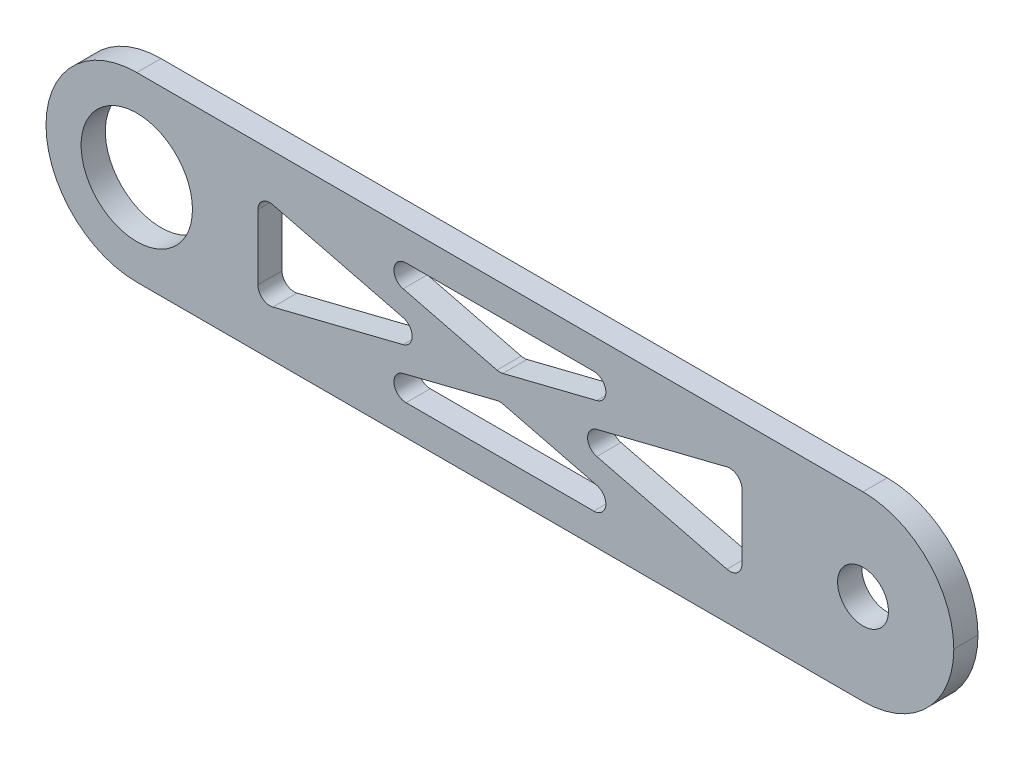
ISO-10303-21;
HEADER;
FILE_DESCRIPTION(('STEP AP214'),'2;1');
FILE_NAME('part.step','',(''),(''),'','','');
FILE_SCHEMA(('AUTOMOTIVE_DESIGN { 1 0 10303 214 1 1 1 1 }'));
ENDSEC;
DATA;
#1=APPLICATION_CONTEXT('core data for automotive mechanical design processes');
#2=APPLICATION_PROTOCOL_DEFINITION('international standard','automotive_design',2000,#1);
#3=PRODUCT_CONTEXT('',#1,'mechanical');
#4=PRODUCT('Part','Part','',(#3));
#5=PRODUCT_RELATED_PRODUCT_CATEGORY('part','',(#4));
#6=PRODUCT_DEFINITION_FORMATION('','',#4);
#7=PRODUCT_DEFINITION_CONTEXT('part definition',#1,'design');
#8=PRODUCT_DEFINITION('design','',#6,#7);
#9=PRODUCT_DEFINITION_SHAPE('','',#8);
#10=(LENGTH_UNIT() NAMED_UNIT(*) SI_UNIT(.MILLI.,.METRE.));
#11=(NAMED_UNIT(*) PLANE_ANGLE_UNIT() SI_UNIT($,.RADIAN.));
#12=(NAMED_UNIT(*) SI_UNIT($,.STERADIAN.) SOLID_ANGLE_UNIT());
#13=UNCERTAINTY_MEASURE_WITH_UNIT(LENGTH_MEASURE(1.E-05),#10,'distance_accuracy_value','');
#14=(GEOMETRIC_REPRESENTATION_CONTEXT(3) GLOBAL_UNCERTAINTY_ASSIGNED_CONTEXT((#13)) GLOBAL_UNIT_ASSIGNED_CONTEXT((#10,
#11,#12)) REPRESENTATION_CONTEXT('',''));
#15=CARTESIAN_POINT('',(0.,0.,0.));
#16=DIRECTION('',(0.,0.,1.));
#17=DIRECTION('',(1.,0.,0.));
#18=AXIS2_PLACEMENT_3D('',#15,#16,#17);
#19=CARTESIAN_POINT('',(0.,0.,-2.));
#20=DIRECTION('',(0.,0.,1.));
#21=DIRECTION('',(-1.,0.,0.));
#22=AXIS2_PLACEMENT_3D('',#19,#20,#21);
#23=PLANE('',#22);
#24=DIRECTION('',(0.970142500145332,-0.242535625036334,0.));
#25=VECTOR('',#24,1.);
#26=CARTESIAN_POINT('',(0.242535625036335,0.970142500145339,-2.));
#27=LINE('',#26,#25);
#28=CARTESIAN_POINT('',(8.00367562619901,-0.970142500145333,-2.));
#29=VERTEX_POINT('',#28);
#30=CARTESIAN_POINT('',(18.7574643749637,-3.6585896873365,-2.));
#31=VERTEX_POINT('',#30);
#32=EDGE_CURVE('E599',#29,#31,#27,.T.);
#33=ORIENTED_EDGE('',*,*,#32,.T.);
#34=CARTESIAN_POINT('',(19.,-2.68844718719117,-2.));
#35=DIRECTION('',(0.,0.,-1.));
#36=DIRECTION('',(-1.,0.,0.));
#37=AXIS2_PLACEMENT_3D('',#34,#35,#36);
#38=CIRCLE('',#37,1.);
#39=CARTESIAN_POINT('',(20.,-2.68844718719117,-2.));
#40=VERTEX_POINT('',#39);
#41=EDGE_CURVE('E391',#40,#31,#38,.T.);
#42=ORIENTED_EDGE('',*,*,#41,.F.);
#43=DIRECTION('',(0.,1.,0.));
#44=VECTOR('',#43,1.);
#45=CARTESIAN_POINT('',(20.,0.,-2.));
#46=LINE('',#45,#44);
#47=CARTESIAN_POINT('',(20.,2.68844718719117,-2.));
#48=VERTEX_POINT('',#47);
#49=EDGE_CURVE('E596',#40,#48,#46,.T.);
#50=ORIENTED_EDGE('',*,*,#49,.T.);
#51=CARTESIAN_POINT('',(19.,2.68844718719117,-2.));
#52=DIRECTION('',(0.,0.,-1.));
#53=DIRECTION('',(-1.,0.,0.));
#54=AXIS2_PLACEMENT_3D('',#51,#52,#53);
#55=CIRCLE('',#54,1.);
#56=CARTESIAN_POINT('',(18.7574643749637,3.6585896873365,-2.));
#57=VERTEX_POINT('',#56);
#58=EDGE_CURVE('E403',#57,#48,#55,.T.);
#59=ORIENTED_EDGE('',*,*,#58,.F.);
#60=DIRECTION('',(0.970142500145332,0.242535625036333,0.));
#61=VECTOR('',#60,1.);
#62=CARTESIAN_POINT('',(0.242535625036335,-0.970142500145338,-2.));
#63=LINE('',#62,#61);
#64=CARTESIAN_POINT('',(8.00367562619901,0.970142500145332,-2.));
#65=VERTEX_POINT('',#64);
#66=EDGE_CURVE('E602',#65,#57,#63,.T.);
#67=ORIENTED_EDGE('',*,*,#66,.F.);
#68=CARTESIAN_POINT('',(8.24621125123534,0.,-2.));
#69=DIRECTION('',(0.,0.,-1.));
#70=DIRECTION('',(-1.,0.,0.));
#71=AXIS2_PLACEMENT_3D('',#68,#69,#70);
#72=CIRCLE('',#71,1.);
#73=EDGE_CURVE('E397',#29,#65,#72,.T.);
#74=ORIENTED_EDGE('',*,*,#73,.F.);
#75=EDGE_LOOP('',(#33,#42,#50,#59,#67,#74));
#76=FACE_BOUND('',#75,.T.);
#77=DIRECTION('',(0.970142500145332,0.242535625036333,0.));
#78=VECTOR('',#77,1.);
#79=CARTESIAN_POINT('',(-0.242535625036333,0.970142500145334,-2.));
#80=LINE('',#79,#78);
#81=CARTESIAN_POINT('',(0.242535625036326,1.0914103126635,-2.));
#82=VERTEX_POINT('',#81);
#83=CARTESIAN_POINT('',(7.996324373801,3.02985749985467,-2.));
#84=VERTEX_POINT('',#83);
#85=EDGE_CURVE('E454',#82,#84,#80,.T.);
#86=ORIENTED_EDGE('',*,*,#85,.T.);
#87=CARTESIAN_POINT('',(7.75378874876467,4.,-2.));
#88=DIRECTION('',(0.,0.,-1.));
#89=DIRECTION('',(-1.,0.,0.));
#90=AXIS2_PLACEMENT_3D('',#87,#88,#89);
#91=CIRCLE('',#90,1.);
#92=CARTESIAN_POINT('',(7.75378874876467,5.,-2.));
#93=VERTEX_POINT('',#92);
#94=EDGE_CURVE('E427',#93,#84,#91,.T.);
#95=ORIENTED_EDGE('',*,*,#94,.F.);
#96=DIRECTION('',(1.,0.,0.));
#97=VECTOR('',#96,1.);
#98=CARTESIAN_POINT('',(0.,5.,-2.));
#99=LINE('',#98,#97);
#100=CARTESIAN_POINT('',(-7.75378874876468,5.,-2.));
#101=VERTEX_POINT('',#100);
#102=EDGE_CURVE('E449',#101,#93,#99,.T.);
#103=ORIENTED_EDGE('',*,*,#102,.F.);
#104=CARTESIAN_POINT('',(-7.75378874876468,4.,-2.));
#105=DIRECTION('',(0.,0.,-1.));
#106=DIRECTION('',(-1.,0.,0.));
#107=AXIS2_PLACEMENT_3D('',#104,#105,#106);
#108=CIRCLE('',#107,1.);
#109=CARTESIAN_POINT('',(-7.99632437380101,3.02985749985467,-2.));
#110=VERTEX_POINT('',#109);
#111=EDGE_CURVE('E421',#110,#101,#108,.T.);
#112=ORIENTED_EDGE('',*,*,#111,.F.);
#113=DIRECTION('',(0.970142500145332,-0.242535625036333,0.));
#114=VECTOR('',#113,1.);
#115=CARTESIAN_POINT('',(0.242535625036333,0.97014250014533,-2.));
#116=LINE('',#115,#114);
#117=CARTESIAN_POINT('',(-0.24253562503634,1.0914103126635,-2.));
#118=VERTEX_POINT('',#117);
#119=EDGE_CURVE('E583',#110,#118,#116,.T.);
#120=ORIENTED_EDGE('',*,*,#119,.T.);
#121=CARTESIAN_POINT('',(0.,2.06155281280883,-2.));
#122=DIRECTION('',(0.,0.,-1.));
#123=DIRECTION('',(-1.,0.,0.));
#124=AXIS2_PLACEMENT_3D('',#121,#122,#123);
#125=CIRCLE('',#124,1.);
#126=EDGE_CURVE('E432',#82,#118,#125,.T.);
#127=ORIENTED_EDGE('',*,*,#126,.F.);
#128=EDGE_LOOP('',(#86,#95,#103,#112,#120,#127));
#129=FACE_BOUND('',#128,.T.);
#130=CARTESIAN_POINT('',(-30.,0.,-2.));
#131=DIRECTION('',(0.,0.,-1.));
#132=DIRECTION('',(-1.,0.,0.));
#133=AXIS2_PLACEMENT_3D('',#130,#131,#132);
#134=CIRCLE('',#133,7.5);
#135=CARTESIAN_POINT('',(-30.,7.5,-2.));
#136=VERTEX_POINT('',#135);
#137=CARTESIAN_POINT('',(-37.5,0.,-2.));
#138=VERTEX_POINT('',#137);
#139=EDGE_CURVE('E280',#136,#138,#134,.F.);
#140=ORIENTED_EDGE('',*,*,#139,.F.);
#141=DIRECTION('',(-1.,0.,0.));
#142=VECTOR('',#141,1.);
#143=CARTESIAN_POINT('',(-37.5,7.5,-2.));
#144=LINE('',#143,#142);
#145=CARTESIAN_POINT('',(30.,7.5,-2.));
#146=VERTEX_POINT('',#145);
#147=EDGE_CURVE('E471',#146,#136,#144,.T.);
#148=ORIENTED_EDGE('',*,*,#147,.F.);
#149=CARTESIAN_POINT('',(30.,0.,-2.));
#150=DIRECTION('',(0.,0.,-1.));
#151=DIRECTION('',(-1.,0.,0.));
#152=AXIS2_PLACEMENT_3D('',#149,#150,#151);
#153=CIRCLE('',#152,7.5);
#154=CARTESIAN_POINT('',(37.5,0.,-2.));
#155=VERTEX_POINT('',#154);
#156=EDGE_CURVE('E277',#155,#146,#153,.F.);
#157=ORIENTED_EDGE('',*,*,#156,.F.);
#158=CARTESIAN_POINT('',(30.,0.,-2.));
#159=DIRECTION('',(0.,0.,-1.));
#160=DIRECTION('',(-1.,0.,0.));
#161=AXIS2_PLACEMENT_3D('',#158,#159,#160);
#162=CIRCLE('',#161,7.5);
#163=CARTESIAN_POINT('',(30.,-7.5,-2.));
#164=VERTEX_POINT('',#163);
#165=EDGE_CURVE('E243',#164,#155,#162,.F.);
#166=ORIENTED_EDGE('',*,*,#165,.F.);
#167=DIRECTION('',(1.,0.,0.));
#168=VECTOR('',#167,1.);
#169=CARTESIAN_POINT('',(-37.5,-7.5,-2.));
#170=LINE('',#169,#168);
#171=CARTESIAN_POINT('',(-30.,-7.5,-2.));
#172=VERTEX_POINT('',#171);
#173=EDGE_CURVE('E257',#172,#164,#170,.T.);
#174=ORIENTED_EDGE('',*,*,#173,.F.);
#175=CARTESIAN_POINT('',(-30.,0.,-2.));
#176=DIRECTION('',(0.,0.,-1.));
#177=DIRECTION('',(-1.,0.,0.));
#178=AXIS2_PLACEMENT_3D('',#175,#176,#177);
#179=CIRCLE('',#178,7.5);
#180=EDGE_CURVE('E283',#138,#172,#179,.F.);
#181=ORIENTED_EDGE('',*,*,#180,.F.);
#182=EDGE_LOOP('',(#140,#148,#157,#166,#174,#181));
#183=FACE_BOUND('',#182,.T.);
#184=CARTESIAN_POINT('',(30.,0.,-2.));
#185=DIRECTION('',(0.,0.,1.));
#186=DIRECTION('',(1.,0.,0.));
#187=AXIS2_PLACEMENT_3D('',#184,#185,#186);
#188=CIRCLE('',#187,2.1);
#189=CARTESIAN_POINT('',(32.1,0.,-2.));
#190=VERTEX_POINT('',#189);
#191=EDGE_CURVE('E464',#190,#190,#188,.T.);
#192=ORIENTED_EDGE('',*,*,#191,.T.);
#193=EDGE_LOOP('',(#192));
#194=FACE_BOUND('',#193,.T.);
#195=CARTESIAN_POINT('',(-30.,0.,-2.));
#196=DIRECTION('',(0.,0.,1.));
#197=DIRECTION('',(1.,0.,0.));
#198=AXIS2_PLACEMENT_3D('',#195,#196,#197);
#199=CIRCLE('',#198,4.6);
#200=CARTESIAN_POINT('',(-25.4,0.,-2.));
#201=VERTEX_POINT('',#200);
#202=EDGE_CURVE('E460',#201,#201,#199,.T.);
#203=ORIENTED_EDGE('',*,*,#202,.T.);
#204=EDGE_LOOP('',(#203));
#205=FACE_BOUND('',#204,.T.);
#206=DIRECTION('',(0.970142500145332,0.242535625036333,0.));
#207=VECTOR('',#206,1.);
#208=CARTESIAN_POINT('',(-0.242535625036334,0.970142500145334,-2.));
#209=LINE('',#208,#207);
#210=CARTESIAN_POINT('',(-18.7574643749637,-3.6585896873365,-2.));
#211=VERTEX_POINT('',#210);
#212=CARTESIAN_POINT('',(-8.003675626199,-0.970142500145333,-2.));
#213=VERTEX_POINT('',#212);
#214=EDGE_CURVE('E448',#211,#213,#209,.T.);
#215=ORIENTED_EDGE('',*,*,#214,.T.);
#216=CARTESIAN_POINT('',(-8.24621125123533,0.,-2.));
#217=DIRECTION('',(0.,0.,-1.));
#218=DIRECTION('',(-1.,0.,0.));
#219=AXIS2_PLACEMENT_3D('',#216,#217,#218);
#220=CIRCLE('',#219,1.);
#221=CARTESIAN_POINT('',(-8.003675626199,0.970142500145331,-2.));
#222=VERTEX_POINT('',#221);
#223=EDGE_CURVE('E409',#222,#213,#220,.T.);
#224=ORIENTED_EDGE('',*,*,#223,.F.);
#225=DIRECTION('',(0.970142500145332,-0.242535625036333,0.));
#226=VECTOR('',#225,1.);
#227=CARTESIAN_POINT('',(-0.242535625036334,-0.970142500145336,-2.));
#228=LINE('',#227,#226);
#229=CARTESIAN_POINT('',(-18.7574643749637,3.6585896873365,-2.));
#230=VERTEX_POINT('',#229);
#231=EDGE_CURVE('E451',#230,#222,#228,.T.);
#232=ORIENTED_EDGE('',*,*,#231,.F.);
#233=CARTESIAN_POINT('',(-19.,2.68844718719117,-2.));
#234=DIRECTION('',(0.,0.,-1.));
#235=DIRECTION('',(-1.,0.,0.));
#236=AXIS2_PLACEMENT_3D('',#233,#234,#235);
#237=CIRCLE('',#236,1.);
#238=CARTESIAN_POINT('',(-20.,2.68844718719117,-2.));
#239=VERTEX_POINT('',#238);
#240=EDGE_CURVE('E415',#239,#230,#237,.T.);
#241=ORIENTED_EDGE('',*,*,#240,.F.);
#242=DIRECTION('',(0.,1.,0.));
#243=VECTOR('',#242,1.);
#244=CARTESIAN_POINT('',(-20.,0.,-2.));
#245=LINE('',#244,#243);
#246=CARTESIAN_POINT('',(-20.,-2.68844718719117,-2.));
#247=VERTEX_POINT('',#246);
#248=EDGE_CURVE('E444',#247,#239,#245,.T.);
#249=ORIENTED_EDGE('',*,*,#248,.F.);
#250=CARTESIAN_POINT('',(-19.,-2.68844718719117,-2.));
#251=DIRECTION('',(0.,0.,-1.));
#252=DIRECTION('',(-1.,0.,0.));
#253=AXIS2_PLACEMENT_3D('',#250,#251,#252);
#254=CIRCLE('',#253,1.);
#255=EDGE_CURVE('E45',#211,#247,#254,.T.);
#256=ORIENTED_EDGE('',*,*,#255,.F.);
#257=EDGE_LOOP('',(#215,#224,#232,#241,#249,#256));
#258=FACE_BOUND('',#257,.T.);
#259=DIRECTION('',(0.970142500145332,0.242535625036333,0.));
#260=VECTOR('',#259,1.);
#261=CARTESIAN_POINT('',(0.242535625036333,-0.97014250014533,-2.));
#262=LINE('',#261,#260);
#263=CARTESIAN_POINT('',(-7.99632437380102,-3.02985749985467,-2.));
#264=VERTEX_POINT('',#263);
#265=CARTESIAN_POINT('',(-0.242535625036344,-1.0914103126635,-2.));
#266=VERTEX_POINT('',#265);
#267=EDGE_CURVE('E590',#264,#266,#262,.T.);
#268=ORIENTED_EDGE('',*,*,#267,.F.);
#269=CARTESIAN_POINT('',(-7.75378874876469,-4.,-2.));
#270=DIRECTION('',(0.,0.,-1.));
#271=DIRECTION('',(-1.,0.,0.));
#272=AXIS2_PLACEMENT_3D('',#269,#270,#271);
#273=CIRCLE('',#272,1.);
#274=CARTESIAN_POINT('',(-7.75378874876469,-5.,-2.));
#275=VERTEX_POINT('',#274);
#276=EDGE_CURVE('E373',#275,#264,#273,.T.);
#277=ORIENTED_EDGE('',*,*,#276,.F.);
#278=DIRECTION('',(1.,0.,0.));
#279=VECTOR('',#278,1.);
#280=CARTESIAN_POINT('',(0.,-5.,-2.));
#281=LINE('',#280,#279);
#282=CARTESIAN_POINT('',(7.75378874876467,-5.,-2.));
#283=VERTEX_POINT('',#282);
#284=EDGE_CURVE('E585',#275,#283,#281,.T.);
#285=ORIENTED_EDGE('',*,*,#284,.T.);
#286=CARTESIAN_POINT('',(7.75378874876467,-4.,-2.));
#287=DIRECTION('',(0.,0.,-1.));
#288=DIRECTION('',(-1.,0.,0.));
#289=AXIS2_PLACEMENT_3D('',#286,#287,#288);
#290=CIRCLE('',#289,1.);
#291=CARTESIAN_POINT('',(7.996324373801,-3.02985749985467,-2.));
#292=VERTEX_POINT('',#291);
#293=EDGE_CURVE('E385',#292,#283,#290,.T.);
#294=ORIENTED_EDGE('',*,*,#293,.F.);
#295=DIRECTION('',(0.970142500145332,-0.242535625036333,0.));
#296=VECTOR('',#295,1.);
#297=CARTESIAN_POINT('',(-0.242535625036334,-0.970142500145335,-2.));
#298=LINE('',#297,#296);
#299=CARTESIAN_POINT('',(0.242535625036322,-1.0914103126635,-2.));
#300=VERTEX_POINT('',#299);
#301=EDGE_CURVE('E593',#300,#292,#298,.T.);
#302=ORIENTED_EDGE('',*,*,#301,.F.);
#303=CARTESIAN_POINT('',(0.,-2.06155281280883,-2.));
#304=DIRECTION('',(0.,0.,-1.));
#305=DIRECTION('',(-1.,0.,0.));
#306=AXIS2_PLACEMENT_3D('',#303,#304,#305);
#307=CIRCLE('',#306,1.);
#308=EDGE_CURVE('E379',#266,#300,#307,.T.);
#309=ORIENTED_EDGE('',*,*,#308,.F.);
#310=EDGE_LOOP('',(#268,#277,#285,#294,#302,#309));
#311=FACE_BOUND('',#310,.T.);
#312=ADVANCED_FACE('F37',(#76,#129,#183,#194,#205,#258,#311),#23,.F.);
#313=CARTESIAN_POINT('',(0.,0.,0.));
#314=DIRECTION('',(0.,0.,1.));
#315=DIRECTION('',(-1.,0.,0.));
#316=AXIS2_PLACEMENT_3D('',#313,#314,#315);
#317=PLANE('',#316);
#318=DIRECTION('',(-0.970142500145332,0.242535625036333,0.));
#319=VECTOR('',#318,1.);
#320=CARTESIAN_POINT('',(0.242535625036333,0.97014250014533,0.));
#321=LINE('',#320,#319);
#322=CARTESIAN_POINT('',(-0.24253562503634,1.0914103126635,0.));
#323=VERTEX_POINT('',#322);
#324=CARTESIAN_POINT('',(-7.99632437380101,3.02985749985467,0.));
#325=VERTEX_POINT('',#324);
#326=EDGE_CURVE('E306',#323,#325,#321,.T.);
#327=ORIENTED_EDGE('',*,*,#326,.T.);
#328=CARTESIAN_POINT('',(-7.75378874876468,4.,0.));
#329=DIRECTION('',(0.,0.,-1.));
#330=DIRECTION('',(-1.,0.,0.));
#331=AXIS2_PLACEMENT_3D('',#328,#329,#330);
#332=CIRCLE('',#331,1.);
#333=CARTESIAN_POINT('',(-7.75378874876468,5.,0.));
#334=VERTEX_POINT('',#333);
#335=EDGE_CURVE('E424',#334,#325,#332,.F.);
#336=ORIENTED_EDGE('',*,*,#335,.F.);
#337=DIRECTION('',(-1.,0.,0.));
#338=VECTOR('',#337,1.);
#339=CARTESIAN_POINT('',(0.,5.,0.));
#340=LINE('',#339,#338);
#341=CARTESIAN_POINT('',(7.75378874876467,5.,0.));
#342=VERTEX_POINT('',#341);
#343=EDGE_CURVE('E303',#342,#334,#340,.T.);
#344=ORIENTED_EDGE('',*,*,#343,.F.);
#345=CARTESIAN_POINT('',(7.75378874876467,4.,0.));
#346=DIRECTION('',(0.,0.,-1.));
#347=DIRECTION('',(-1.,0.,0.));
#348=AXIS2_PLACEMENT_3D('',#345,#346,#347);
#349=CIRCLE('',#348,1.);
#350=CARTESIAN_POINT('',(7.996324373801,3.02985749985467,0.));
#351=VERTEX_POINT('',#350);
#352=EDGE_CURVE('E429',#351,#342,#349,.F.);
#353=ORIENTED_EDGE('',*,*,#352,.F.);
#354=DIRECTION('',(-0.970142500145332,-0.242535625036333,0.));
#355=VECTOR('',#354,1.);
#356=CARTESIAN_POINT('',(-0.242535625036333,0.970142500145333,0.));
#357=LINE('',#356,#355);
#358=CARTESIAN_POINT('',(0.242535625036326,1.0914103126635,0.));
#359=VERTEX_POINT('',#358);
#360=EDGE_CURVE('E300',#351,#359,#357,.T.);
#361=ORIENTED_EDGE('',*,*,#360,.T.);
#362=CARTESIAN_POINT('',(0.,2.06155281280883,0.));
#363=DIRECTION('',(0.,0.,-1.));
#364=DIRECTION('',(-1.,0.,0.));
#365=AXIS2_PLACEMENT_3D('',#362,#363,#364);
#366=CIRCLE('',#365,1.);
#367=EDGE_CURVE('E434',#323,#359,#366,.F.);
#368=ORIENTED_EDGE('',*,*,#367,.F.);
#369=EDGE_LOOP('',(#327,#336,#344,#353,#361,#368));
#370=FACE_BOUND('',#369,.T.);
#371=CARTESIAN_POINT('',(-30.,0.,0.));
#372=DIRECTION('',(0.,0.,1.));
#373=DIRECTION('',(1.,0.,0.));
#374=AXIS2_PLACEMENT_3D('',#371,#372,#373);
#375=CIRCLE('',#374,4.6);
#376=CARTESIAN_POINT('',(-25.4,0.,0.));
#377=VERTEX_POINT('',#376);
#378=EDGE_CURVE('E461',#377,#377,#375,.T.);
#379=ORIENTED_EDGE('',*,*,#378,.F.);
#380=EDGE_LOOP('',(#379));
#381=FACE_BOUND('',#380,.T.);
#382=CARTESIAN_POINT('',(30.,0.,0.));
#383=DIRECTION('',(0.,0.,1.));
#384=DIRECTION('',(1.,0.,0.));
#385=AXIS2_PLACEMENT_3D('',#382,#383,#384);
#386=CIRCLE('',#385,2.1);
#387=CARTESIAN_POINT('',(32.1,0.,0.));
#388=VERTEX_POINT('',#387);
#389=EDGE_CURVE('E291',#388,#388,#386,.T.);
#390=ORIENTED_EDGE('',*,*,#389,.F.);
#391=EDGE_LOOP('',(#390));
#392=FACE_BOUND('',#391,.T.);
#393=DIRECTION('',(1.,0.,0.));
#394=VECTOR('',#393,1.);
#395=CARTESIAN_POINT('',(-37.5,-7.5,0.));
#396=LINE('',#395,#394);
#397=CARTESIAN_POINT('',(-30.,-7.5,0.));
#398=VERTEX_POINT('',#397);
#399=CARTESIAN_POINT('',(30.,-7.5,0.));
#400=VERTEX_POINT('',#399);
#401=EDGE_CURVE('E263',#398,#400,#396,.T.);
#402=ORIENTED_EDGE('',*,*,#401,.T.);
#403=CARTESIAN_POINT('',(30.,0.,0.));
#404=DIRECTION('',(0.,0.,-1.));
#405=DIRECTION('',(-1.,0.,0.));
#406=AXIS2_PLACEMENT_3D('',#403,#404,#405);
#407=CIRCLE('',#406,7.5);
#408=CARTESIAN_POINT('',(37.5,0.,0.));
#409=VERTEX_POINT('',#408);
#410=EDGE_CURVE('E240',#409,#400,#407,.T.);
#411=ORIENTED_EDGE('',*,*,#410,.F.);
#412=CARTESIAN_POINT('',(30.,0.,0.));
#413=DIRECTION('',(0.,0.,-1.));
#414=DIRECTION('',(-1.,0.,0.));
#415=AXIS2_PLACEMENT_3D('',#412,#413,#414);
#416=CIRCLE('',#415,7.5);
#417=CARTESIAN_POINT('',(30.,7.5,0.));
#418=VERTEX_POINT('',#417);
#419=EDGE_CURVE('E251',#418,#409,#416,.T.);
#420=ORIENTED_EDGE('',*,*,#419,.F.);
#421=DIRECTION('',(-1.,0.,0.));
#422=VECTOR('',#421,1.);
#423=CARTESIAN_POINT('',(-37.5,7.5,0.));
#424=LINE('',#423,#422);
#425=CARTESIAN_POINT('',(-30.,7.5,0.));
#426=VERTEX_POINT('',#425);
#427=EDGE_CURVE('E247',#418,#426,#424,.T.);
#428=ORIENTED_EDGE('',*,*,#427,.T.);
#429=CARTESIAN_POINT('',(-30.,0.,0.));
#430=DIRECTION('',(0.,0.,-1.));
#431=DIRECTION('',(-1.,0.,0.));
#432=AXIS2_PLACEMENT_3D('',#429,#430,#431);
#433=CIRCLE('',#432,7.5);
#434=CARTESIAN_POINT('',(-37.5,0.,0.));
#435=VERTEX_POINT('',#434);
#436=EDGE_CURVE('E264',#435,#426,#433,.T.);
#437=ORIENTED_EDGE('',*,*,#436,.F.);
#438=CARTESIAN_POINT('',(-30.,0.,0.));
#439=DIRECTION('',(0.,0.,-1.));
#440=DIRECTION('',(-1.,0.,0.));
#441=AXIS2_PLACEMENT_3D('',#438,#439,#440);
#442=CIRCLE('',#441,7.5);
#443=EDGE_CURVE('E267',#398,#435,#442,.T.);
#444=ORIENTED_EDGE('',*,*,#443,.F.);
#445=EDGE_LOOP('',(#402,#411,#420,#428,#437,#444));
#446=FACE_BOUND('',#445,.T.);
#447=DIRECTION('',(-0.970142500145332,-0.242535625036333,0.));
#448=VECTOR('',#447,1.);
#449=CARTESIAN_POINT('',(-0.242535625036334,0.970142500145334,0.));
#450=LINE('',#449,#448);
#451=CARTESIAN_POINT('',(-8.003675626199,-0.970142500145333,0.));
#452=VERTEX_POINT('',#451);
#453=CARTESIAN_POINT('',(-18.7574643749637,-3.6585896873365,0.));
#454=VERTEX_POINT('',#453);
#455=EDGE_CURVE('E288',#452,#454,#450,.T.);
#456=ORIENTED_EDGE('',*,*,#455,.T.);
#457=CARTESIAN_POINT('',(-19.,-2.68844718719117,0.));
#458=DIRECTION('',(0.,0.,-1.));
#459=DIRECTION('',(-1.,0.,0.));
#460=AXIS2_PLACEMENT_3D('',#457,#458,#459);
#461=CIRCLE('',#460,1.);
#462=CARTESIAN_POINT('',(-20.,-2.68844718719117,0.));
#463=VERTEX_POINT('',#462);
#464=EDGE_CURVE('E11',#463,#454,#461,.F.);
#465=ORIENTED_EDGE('',*,*,#464,.F.);
#466=DIRECTION('',(0.,-1.,0.));
#467=VECTOR('',#466,1.);
#468=CARTESIAN_POINT('',(-20.,0.,0.));
#469=LINE('',#468,#467);
#470=CARTESIAN_POINT('',(-20.,2.68844718719117,0.));
#471=VERTEX_POINT('',#470);
#472=EDGE_CURVE('E297',#471,#463,#469,.T.);
#473=ORIENTED_EDGE('',*,*,#472,.F.);
#474=CARTESIAN_POINT('',(-19.,2.68844718719117,0.));
#475=DIRECTION('',(0.,0.,-1.));
#476=DIRECTION('',(-1.,0.,0.));
#477=AXIS2_PLACEMENT_3D('',#474,#475,#476);
#478=CIRCLE('',#477,1.);
#479=CARTESIAN_POINT('',(-18.7574643749637,3.6585896873365,0.));
#480=VERTEX_POINT('',#479);
#481=EDGE_CURVE('E418',#480,#471,#478,.F.);
#482=ORIENTED_EDGE('',*,*,#481,.F.);
#483=DIRECTION('',(-0.970142500145332,0.242535625036333,0.));
#484=VECTOR('',#483,1.);
#485=CARTESIAN_POINT('',(-0.242535625036334,-0.970142500145336,0.));
#486=LINE('',#485,#484);
#487=CARTESIAN_POINT('',(-8.003675626199,0.970142500145331,0.));
#488=VERTEX_POINT('',#487);
#489=EDGE_CURVE('E294',#488,#480,#486,.T.);
#490=ORIENTED_EDGE('',*,*,#489,.F.);
#491=CARTESIAN_POINT('',(-8.24621125123533,0.,0.));
#492=DIRECTION('',(0.,0.,-1.));
#493=DIRECTION('',(-1.,0.,0.));
#494=AXIS2_PLACEMENT_3D('',#491,#492,#493);
#495=CIRCLE('',#494,1.);
#496=EDGE_CURVE('E412',#452,#488,#495,.F.);
#497=ORIENTED_EDGE('',*,*,#496,.F.);
#498=EDGE_LOOP('',(#456,#465,#473,#482,#490,#497));
#499=FACE_BOUND('',#498,.T.);
#500=DIRECTION('',(0.,-1.,0.));
#501=VECTOR('',#500,1.);
#502=CARTESIAN_POINT('',(20.,0.,0.));
#503=LINE('',#502,#501);
#504=CARTESIAN_POINT('',(20.,2.68844718719117,0.));
#505=VERTEX_POINT('',#504);
#506=CARTESIAN_POINT('',(20.,-2.68844718719117,0.));
#507=VERTEX_POINT('',#506);
#508=EDGE_CURVE('E312',#505,#507,#503,.T.);
#509=ORIENTED_EDGE('',*,*,#508,.T.);
#510=CARTESIAN_POINT('',(19.,-2.68844718719117,0.));
#511=DIRECTION('',(0.,0.,-1.));
#512=DIRECTION('',(-1.,0.,0.));
#513=AXIS2_PLACEMENT_3D('',#510,#511,#512);
#514=CIRCLE('',#513,1.);
#515=CARTESIAN_POINT('',(18.7574643749637,-3.6585896873365,0.));
#516=VERTEX_POINT('',#515);
#517=EDGE_CURVE('E394',#516,#507,#514,.F.);
#518=ORIENTED_EDGE('',*,*,#517,.F.);
#519=DIRECTION('',(-0.970142500145332,0.242535625036333,0.));
#520=VECTOR('',#519,1.);
#521=CARTESIAN_POINT('',(0.242535625036335,0.970142500145339,0.));
#522=LINE('',#521,#520);
#523=CARTESIAN_POINT('',(8.00367562619901,-0.970142500145333,0.));
#524=VERTEX_POINT('',#523);
#525=EDGE_CURVE('E309',#516,#524,#522,.T.);
#526=ORIENTED_EDGE('',*,*,#525,.T.);
#527=CARTESIAN_POINT('',(8.24621125123534,0.,0.));
#528=DIRECTION('',(0.,0.,-1.));
#529=DIRECTION('',(-1.,0.,0.));
#530=AXIS2_PLACEMENT_3D('',#527,#528,#529);
#531=CIRCLE('',#530,1.);
#532=CARTESIAN_POINT('',(8.00367562619901,0.970142500145332,0.));
#533=VERTEX_POINT('',#532);
#534=EDGE_CURVE('E400',#533,#524,#531,.F.);
#535=ORIENTED_EDGE('',*,*,#534,.F.);
#536=DIRECTION('',(-0.970142500145332,-0.242535625036333,0.));
#537=VECTOR('',#536,1.);
#538=CARTESIAN_POINT('',(0.242535625036335,-0.970142500145338,0.));
#539=LINE('',#538,#537);
#540=CARTESIAN_POINT('',(18.7574643749637,3.6585896873365,0.));
#541=VERTEX_POINT('',#540);
#542=EDGE_CURVE('E315',#541,#533,#539,.T.);
#543=ORIENTED_EDGE('',*,*,#542,.F.);
#544=CARTESIAN_POINT('',(19.,2.68844718719117,0.));
#545=DIRECTION('',(0.,0.,-1.));
#546=DIRECTION('',(-1.,0.,0.));
#547=AXIS2_PLACEMENT_3D('',#544,#545,#546);
#548=CIRCLE('',#547,1.);
#549=EDGE_CURVE('E406',#505,#541,#548,.F.);
#550=ORIENTED_EDGE('',*,*,#549,.F.);
#551=EDGE_LOOP('',(#509,#518,#526,#535,#543,#550));
#552=FACE_BOUND('',#551,.T.);
#553=DIRECTION('',(-1.,0.,0.));
#554=VECTOR('',#553,1.);
#555=CARTESIAN_POINT('',(0.,-5.,0.));
#556=LINE('',#555,#554);
#557=CARTESIAN_POINT('',(7.75378874876467,-5.,0.));
#558=VERTEX_POINT('',#557);
#559=CARTESIAN_POINT('',(-7.75378874876469,-5.,0.));
#560=VERTEX_POINT('',#559);
#561=EDGE_CURVE('E321',#558,#560,#556,.T.);
#562=ORIENTED_EDGE('',*,*,#561,.T.);
#563=CARTESIAN_POINT('',(-7.75378874876469,-4.,0.));
#564=DIRECTION('',(0.,0.,-1.));
#565=DIRECTION('',(-1.,0.,0.));
#566=AXIS2_PLACEMENT_3D('',#563,#564,#565);
#567=CIRCLE('',#566,1.);
#568=CARTESIAN_POINT('',(-7.99632437380103,-3.02985749985467,0.));
#569=VERTEX_POINT('',#568);
#570=EDGE_CURVE('E376',#569,#560,#567,.F.);
#571=ORIENTED_EDGE('',*,*,#570,.F.);
#572=DIRECTION('',(-0.970142500145332,-0.242535625036333,0.));
#573=VECTOR('',#572,1.);
#574=CARTESIAN_POINT('',(0.242535625036333,-0.97014250014533,0.));
#575=LINE('',#574,#573);
#576=CARTESIAN_POINT('',(-0.242535625036344,-1.0914103126635,0.));
#577=VERTEX_POINT('',#576);
#578=EDGE_CURVE('E318',#577,#569,#575,.T.);
#579=ORIENTED_EDGE('',*,*,#578,.F.);
#580=CARTESIAN_POINT('',(0.,-2.06155281280883,0.));
#581=DIRECTION('',(0.,0.,-1.));
#582=DIRECTION('',(-1.,0.,0.));
#583=AXIS2_PLACEMENT_3D('',#580,#581,#582);
#584=CIRCLE('',#583,1.);
#585=CARTESIAN_POINT('',(0.242535625036322,-1.0914103126635,0.));
#586=VERTEX_POINT('',#585);
#587=EDGE_CURVE('E382',#586,#577,#584,.F.);
#588=ORIENTED_EDGE('',*,*,#587,.F.);
#589=DIRECTION('',(-0.970142500145332,0.242535625036333,0.));
#590=VECTOR('',#589,1.);
#591=CARTESIAN_POINT('',(-0.242535625036334,-0.970142500145335,0.));
#592=LINE('',#591,#590);
#593=CARTESIAN_POINT('',(7.996324373801,-3.02985749985467,0.));
#594=VERTEX_POINT('',#593);
#595=EDGE_CURVE('E324',#594,#586,#592,.T.);
#596=ORIENTED_EDGE('',*,*,#595,.F.);
#597=CARTESIAN_POINT('',(7.75378874876467,-4.,0.));
#598=DIRECTION('',(0.,0.,-1.));
#599=DIRECTION('',(-1.,0.,0.));
#600=AXIS2_PLACEMENT_3D('',#597,#598,#599);
#601=CIRCLE('',#600,1.);
#602=EDGE_CURVE('E388',#558,#594,#601,.F.);
#603=ORIENTED_EDGE('',*,*,#602,.F.);
#604=EDGE_LOOP('',(#562,#571,#579,#588,#596,#603));
#605=FACE_BOUND('',#604,.T.);
#606=ADVANCED_FACE('F259',(#370,#381,#392,#446,#499,#552,#605),#317,.T.);
#607=CARTESIAN_POINT('',(-37.5,7.5,-2.));
#608=DIRECTION('',(0.,-1.,0.));
#609=DIRECTION('',(0.,0.,1.));
#610=AXIS2_PLACEMENT_3D('',#607,#608,#609);
#611=PLANE('',#610);
#612=ORIENTED_EDGE('',*,*,#427,.F.);
#613=DIRECTION('',(0.,0.,1.));
#614=VECTOR('',#613,1.);
#615=CARTESIAN_POINT('',(30.,7.5,-2.));
#616=LINE('',#615,#614);
#617=EDGE_CURVE('E253',#146,#418,#616,.T.);
#618=ORIENTED_EDGE('',*,*,#617,.F.);
#619=ORIENTED_EDGE('',*,*,#147,.T.);
#620=DIRECTION('',(0.,0.,1.));
#621=VECTOR('',#620,1.);
#622=CARTESIAN_POINT('',(-30.,7.5,-2.));
#623=LINE('',#622,#621);
#624=EDGE_CURVE('E287',#426,#136,#623,.F.);
#625=ORIENTED_EDGE('',*,*,#624,.F.);
#626=EDGE_LOOP('',(#612,#618,#619,#625));
#627=FACE_BOUND('',#626,.T.);
#628=ADVANCED_FACE('F478',(#627),#611,.F.);
#629=CARTESIAN_POINT('',(-37.5,-7.5,-2.));
#630=DIRECTION('',(0.,1.,0.));
#631=DIRECTION('',(0.,0.,-1.));
#632=AXIS2_PLACEMENT_3D('',#629,#630,#631);
#633=PLANE('',#632);
#634=ORIENTED_EDGE('',*,*,#401,.F.);
#635=DIRECTION('',(0.,0.,1.));
#636=VECTOR('',#635,1.);
#637=CARTESIAN_POINT('',(-30.,-7.5,-2.));
#638=LINE('',#637,#636);
#639=EDGE_CURVE('E273',#172,#398,#638,.T.);
#640=ORIENTED_EDGE('',*,*,#639,.F.);
#641=ORIENTED_EDGE('',*,*,#173,.T.);
#642=DIRECTION('',(0.,0.,1.));
#643=VECTOR('',#642,1.);
#644=CARTESIAN_POINT('',(30.,-7.5,-2.));
#645=LINE('',#644,#643);
#646=EDGE_CURVE('E275',#400,#164,#645,.F.);
#647=ORIENTED_EDGE('',*,*,#646,.F.);
#648=EDGE_LOOP('',(#634,#640,#641,#647));
#649=FACE_BOUND('',#648,.T.);
#650=ADVANCED_FACE('F487',(#649),#633,.F.);
#651=CARTESIAN_POINT('',(30.,0.,-2.));
#652=DIRECTION('',(0.,0.,1.));
#653=DIRECTION('',(-1.,0.,0.));
#654=AXIS2_PLACEMENT_3D('',#651,#652,#653);
#655=CYLINDRICAL_SURFACE('',#654,7.5);
#656=ORIENTED_EDGE('',*,*,#617,.T.);
#657=ORIENTED_EDGE('',*,*,#419,.T.);
#658=DIRECTION('',(0.,0.,1.));
#659=VECTOR('',#658,1.);
#660=CARTESIAN_POINT('',(37.5,0.,-2.));
#661=LINE('',#660,#659);
#662=EDGE_CURVE('E236',#409,#155,#661,.F.);
#663=ORIENTED_EDGE('',*,*,#662,.T.);
#664=ORIENTED_EDGE('',*,*,#156,.T.);
#665=EDGE_LOOP('',(#656,#657,#663,#664));
#666=FACE_BOUND('',#665,.T.);
#667=ADVANCED_FACE('F252',(#666),#655,.T.);
#668=CARTESIAN_POINT('',(30.,0.,-2.));
#669=DIRECTION('',(0.,0.,1.));
#670=DIRECTION('',(-1.,0.,0.));
#671=AXIS2_PLACEMENT_3D('',#668,#669,#670);
#672=CYLINDRICAL_SURFACE('',#671,7.5);
#673=ORIENTED_EDGE('',*,*,#165,.T.);
#674=ORIENTED_EDGE('',*,*,#662,.F.);
#675=ORIENTED_EDGE('',*,*,#410,.T.);
#676=ORIENTED_EDGE('',*,*,#646,.T.);
#677=EDGE_LOOP('',(#673,#674,#675,#676));
#678=FACE_BOUND('',#677,.T.);
#679=ADVANCED_FACE('F238',(#678),#672,.T.);
#680=CARTESIAN_POINT('',(-30.,0.,-2.));
#681=DIRECTION('',(0.,0.,1.));
#682=DIRECTION('',(-1.,0.,0.));
#683=AXIS2_PLACEMENT_3D('',#680,#681,#682);
#684=CYLINDRICAL_SURFACE('',#683,7.5);
#685=DIRECTION('',(0.,0.,1.));
#686=VECTOR('',#685,1.);
#687=CARTESIAN_POINT('',(-37.5,0.,-2.));
#688=LINE('',#687,#686);
#689=EDGE_CURVE('E248',#138,#435,#688,.T.);
#690=ORIENTED_EDGE('',*,*,#689,.T.);
#691=ORIENTED_EDGE('',*,*,#436,.T.);
#692=ORIENTED_EDGE('',*,*,#624,.T.);
#693=ORIENTED_EDGE('',*,*,#139,.T.);
#694=EDGE_LOOP('',(#690,#691,#692,#693));
#695=FACE_BOUND('',#694,.T.);
#696=ADVANCED_FACE('F482',(#695),#684,.T.);
#697=CARTESIAN_POINT('',(-30.,0.,-2.));
#698=DIRECTION('',(0.,0.,1.));
#699=DIRECTION('',(-1.,0.,0.));
#700=AXIS2_PLACEMENT_3D('',#697,#698,#699);
#701=CYLINDRICAL_SURFACE('',#700,7.5);
#702=ORIENTED_EDGE('',*,*,#180,.T.);
#703=ORIENTED_EDGE('',*,*,#639,.T.);
#704=ORIENTED_EDGE('',*,*,#443,.T.);
#705=ORIENTED_EDGE('',*,*,#689,.F.);
#706=EDGE_LOOP('',(#702,#703,#704,#705));
#707=FACE_BOUND('',#706,.T.);
#708=ADVANCED_FACE('F485',(#707),#701,.T.);
#709=CARTESIAN_POINT('',(30.,0.,0.));
#710=DIRECTION('',(0.,0.,-1.));
#711=DIRECTION('',(1.,0.,0.));
#712=AXIS2_PLACEMENT_3D('',#709,#710,#711);
#713=CYLINDRICAL_SURFACE('',#712,2.1);
#714=ORIENTED_EDGE('',*,*,#389,.T.);
#715=EDGE_LOOP('',(#714));
#716=FACE_BOUND('',#715,.T.);
#717=ORIENTED_EDGE('',*,*,#191,.F.);
#718=EDGE_LOOP('',(#717));
#719=FACE_BOUND('',#718,.T.);
#720=ADVANCED_FACE('F501',(#716,#719),#713,.F.);
#721=CARTESIAN_POINT('',(-30.,0.,0.));
#722=DIRECTION('',(0.,0.,-1.));
#723=DIRECTION('',(1.,0.,0.));
#724=AXIS2_PLACEMENT_3D('',#721,#722,#723);
#725=CYLINDRICAL_SURFACE('',#724,4.6);
#726=ORIENTED_EDGE('',*,*,#378,.T.);
#727=EDGE_LOOP('',(#726));
#728=FACE_BOUND('',#727,.T.);
#729=ORIENTED_EDGE('',*,*,#202,.F.);
#730=EDGE_LOOP('',(#729));
#731=FACE_BOUND('',#730,.T.);
#732=ADVANCED_FACE('F498',(#728,#731),#725,.F.);
#733=CARTESIAN_POINT('',(-20.,0.,8.));
#734=DIRECTION('',(1.,0.,0.));
#735=DIRECTION('',(0.,0.,1.));
#736=AXIS2_PLACEMENT_3D('',#733,#734,#735);
#737=PLANE('',#736);
#738=ORIENTED_EDGE('',*,*,#472,.T.);
#739=DIRECTION('',(0.,0.,-1.));
#740=VECTOR('',#739,1.);
#741=CARTESIAN_POINT('',(-20.,-2.68844718719117,8.));
#742=LINE('',#741,#740);
#743=EDGE_CURVE('E359',#247,#463,#742,.F.);
#744=ORIENTED_EDGE('',*,*,#743,.F.);
#745=ORIENTED_EDGE('',*,*,#248,.T.);
#746=DIRECTION('',(0.,0.,-1.));
#747=VECTOR('',#746,1.);
#748=CARTESIAN_POINT('',(-20.,2.68844718719117,-2.));
#749=LINE('',#748,#747);
#750=EDGE_CURVE('E361',#471,#239,#749,.T.);
#751=ORIENTED_EDGE('',*,*,#750,.F.);
#752=EDGE_LOOP('',(#738,#744,#745,#751));
#753=FACE_BOUND('',#752,.T.);
#754=ADVANCED_FACE('F500',(#753),#737,.T.);
#755=CARTESIAN_POINT('',(-0.242535625036334,-0.970142500145336,8.));
#756=DIRECTION('',(-0.242535625036333,-0.970142500145332,0.));
#757=DIRECTION('',(0.970142500145332,-0.242535625036333,0.));
#758=AXIS2_PLACEMENT_3D('',#755,#756,#757);
#759=PLANE('',#758);
#760=ORIENTED_EDGE('',*,*,#489,.T.);
#761=DIRECTION('',(0.,0.,-1.));
#762=VECTOR('',#761,1.);
#763=CARTESIAN_POINT('',(-18.7574643749637,3.6585896873365,0.));
#764=LINE('',#763,#762);
#765=EDGE_CURVE('E351',#230,#480,#764,.F.);
#766=ORIENTED_EDGE('',*,*,#765,.F.);
#767=ORIENTED_EDGE('',*,*,#231,.T.);
#768=DIRECTION('',(0.,0.,-1.));
#769=VECTOR('',#768,1.);
#770=CARTESIAN_POINT('',(-8.003675626199,0.97014250014533,8.));
#771=LINE('',#770,#769);
#772=EDGE_CURVE('E353',#488,#222,#771,.T.);
#773=ORIENTED_EDGE('',*,*,#772,.F.);
#774=EDGE_LOOP('',(#760,#766,#767,#773));
#775=FACE_BOUND('',#774,.T.);
#776=ADVANCED_FACE('F508',(#775),#759,.T.);
#777=CARTESIAN_POINT('',(-0.242535625036334,0.970142500145334,8.));
#778=DIRECTION('',(0.242535625036333,-0.970142500145332,0.));
#779=DIRECTION('',(0.970142500145332,0.242535625036333,0.));
#780=AXIS2_PLACEMENT_3D('',#777,#778,#779);
#781=PLANE('',#780);
#782=ORIENTED_EDGE('',*,*,#214,.F.);
#783=DIRECTION('',(0.,0.,-1.));
#784=VECTOR('',#783,1.);
#785=CARTESIAN_POINT('',(-18.7574643749637,-3.6585896873365,8.));
#786=LINE('',#785,#784);
#787=EDGE_CURVE('E355',#454,#211,#786,.T.);
#788=ORIENTED_EDGE('',*,*,#787,.F.);
#789=ORIENTED_EDGE('',*,*,#455,.F.);
#790=DIRECTION('',(0.,0.,-1.));
#791=VECTOR('',#790,1.);
#792=CARTESIAN_POINT('',(-8.003675626199,-0.970142500145333,8.));
#793=LINE('',#792,#791);
#794=EDGE_CURVE('E357',#213,#452,#793,.F.);
#795=ORIENTED_EDGE('',*,*,#794,.F.);
#796=EDGE_LOOP('',(#782,#788,#789,#795));
#797=FACE_BOUND('',#796,.T.);
#798=ADVANCED_FACE('F653',(#797),#781,.F.);
#799=CARTESIAN_POINT('',(0.242535625036333,0.97014250014533,8.));
#800=DIRECTION('',(-0.242535625036333,-0.970142500145332,0.));
#801=DIRECTION('',(0.970142500145332,-0.242535625036333,0.));
#802=AXIS2_PLACEMENT_3D('',#799,#800,#801);
#803=PLANE('',#802);
#804=ORIENTED_EDGE('',*,*,#326,.F.);
#805=DIRECTION('',(0.,0.,-1.));
#806=VECTOR('',#805,1.);
#807=CARTESIAN_POINT('',(-0.24253562503634,1.0914103126635,0.));
#808=LINE('',#807,#806);
#809=EDGE_CURVE('E363',#118,#323,#808,.F.);
#810=ORIENTED_EDGE('',*,*,#809,.F.);
#811=ORIENTED_EDGE('',*,*,#119,.F.);
#812=DIRECTION('',(0.,0.,-1.));
#813=VECTOR('',#812,1.);
#814=CARTESIAN_POINT('',(-7.99632437380101,3.02985749985467,8.));
#815=LINE('',#814,#813);
#816=EDGE_CURVE('E365',#325,#110,#815,.T.);
#817=ORIENTED_EDGE('',*,*,#816,.F.);
#818=EDGE_LOOP('',(#804,#810,#811,#817));
#819=FACE_BOUND('',#818,.T.);
#820=ADVANCED_FACE('F647',(#819),#803,.F.);
#821=CARTESIAN_POINT('',(0.,5.,8.));
#822=DIRECTION('',(0.,-1.,0.));
#823=DIRECTION('',(0.,0.,1.));
#824=AXIS2_PLACEMENT_3D('',#821,#822,#823);
#825=PLANE('',#824);
#826=ORIENTED_EDGE('',*,*,#102,.T.);
#827=DIRECTION('',(0.,0.,-1.));
#828=VECTOR('',#827,1.);
#829=CARTESIAN_POINT('',(7.75378874876467,5.,8.));
#830=LINE('',#829,#828);
#831=EDGE_CURVE('E367',#342,#93,#830,.T.);
#832=ORIENTED_EDGE('',*,*,#831,.F.);
#833=ORIENTED_EDGE('',*,*,#343,.T.);
#834=DIRECTION('',(0.,0.,-1.));
#835=VECTOR('',#834,1.);
#836=CARTESIAN_POINT('',(-7.75378874876468,5.,8.));
#837=LINE('',#836,#835);
#838=EDGE_CURVE('E369',#101,#334,#837,.F.);
#839=ORIENTED_EDGE('',*,*,#838,.F.);
#840=EDGE_LOOP('',(#826,#832,#833,#839));
#841=FACE_BOUND('',#840,.T.);
#842=ADVANCED_FACE('F644',(#841),#825,.T.);
#843=CARTESIAN_POINT('',(-0.242535625036333,0.970142500145334,8.));
#844=DIRECTION('',(0.242535625036333,-0.970142500145332,0.));
#845=DIRECTION('',(0.970142500145332,0.242535625036333,0.));
#846=AXIS2_PLACEMENT_3D('',#843,#844,#845);
#847=PLANE('',#846);
#848=ORIENTED_EDGE('',*,*,#85,.F.);
#849=DIRECTION('',(0.,0.,-1.));
#850=VECTOR('',#849,1.);
#851=CARTESIAN_POINT('',(0.242535625036326,1.0914103126635,-2.));
#852=LINE('',#851,#850);
#853=EDGE_CURVE('E60',#359,#82,#852,.T.);
#854=ORIENTED_EDGE('',*,*,#853,.F.);
#855=ORIENTED_EDGE('',*,*,#360,.F.);
#856=DIRECTION('',(0.,0.,-1.));
#857=VECTOR('',#856,1.);
#858=CARTESIAN_POINT('',(7.996324373801,3.02985749985467,8.));
#859=LINE('',#858,#857);
#860=EDGE_CURVE('E52',#84,#351,#859,.F.);
#861=ORIENTED_EDGE('',*,*,#860,.F.);
#862=EDGE_LOOP('',(#848,#854,#855,#861));
#863=FACE_BOUND('',#862,.T.);
#864=ADVANCED_FACE('F579',(#863),#847,.F.);
#865=CARTESIAN_POINT('',(0.242535625036335,-0.970142500145338,8.));
#866=DIRECTION('',(0.242535625036333,-0.970142500145332,0.));
#867=DIRECTION('',(0.970142500145332,0.242535625036333,0.));
#868=AXIS2_PLACEMENT_3D('',#865,#866,#867);
#869=PLANE('',#868);
#870=ORIENTED_EDGE('',*,*,#66,.T.);
#871=DIRECTION('',(0.,0.,-1.));
#872=VECTOR('',#871,1.);
#873=CARTESIAN_POINT('',(18.7574643749637,3.6585896873365,8.));
#874=LINE('',#873,#872);
#875=EDGE_CURVE('E347',#541,#57,#874,.T.);
#876=ORIENTED_EDGE('',*,*,#875,.F.);
#877=ORIENTED_EDGE('',*,*,#542,.T.);
#878=DIRECTION('',(0.,0.,-1.));
#879=VECTOR('',#878,1.);
#880=CARTESIAN_POINT('',(8.003675626199,0.970142500145331,8.));
#881=LINE('',#880,#879);
#882=EDGE_CURVE('E349',#65,#533,#881,.F.);
#883=ORIENTED_EDGE('',*,*,#882,.F.);
#884=EDGE_LOOP('',(#870,#876,#877,#883));
#885=FACE_BOUND('',#884,.T.);
#886=ADVANCED_FACE('F607',(#885),#869,.T.);
#887=CARTESIAN_POINT('',(20.,0.,8.));
#888=DIRECTION('',(1.,0.,0.));
#889=DIRECTION('',(0.,0.,1.));
#890=AXIS2_PLACEMENT_3D('',#887,#888,#889);
#891=PLANE('',#890);
#892=ORIENTED_EDGE('',*,*,#508,.F.);
#893=DIRECTION('',(0.,0.,-1.));
#894=VECTOR('',#893,1.);
#895=CARTESIAN_POINT('',(20.,2.68844718719117,8.));
#896=LINE('',#895,#894);
#897=EDGE_CURVE('E339',#48,#505,#896,.F.);
#898=ORIENTED_EDGE('',*,*,#897,.F.);
#899=ORIENTED_EDGE('',*,*,#49,.F.);
#900=DIRECTION('',(0.,0.,-1.));
#901=VECTOR('',#900,1.);
#902=CARTESIAN_POINT('',(20.,-2.68844718719117,-2.));
#903=LINE('',#902,#901);
#904=EDGE_CURVE('E341',#507,#40,#903,.T.);
#905=ORIENTED_EDGE('',*,*,#904,.F.);
#906=EDGE_LOOP('',(#892,#898,#899,#905));
#907=FACE_BOUND('',#906,.T.);
#908=ADVANCED_FACE('F623',(#907),#891,.F.);
#909=CARTESIAN_POINT('',(0.242535625036335,0.970142500145339,8.));
#910=DIRECTION('',(-0.242535625036333,-0.970142500145332,0.));
#911=DIRECTION('',(0.970142500145332,-0.242535625036333,0.));
#912=AXIS2_PLACEMENT_3D('',#909,#910,#911);
#913=PLANE('',#912);
#914=ORIENTED_EDGE('',*,*,#32,.F.);
#915=DIRECTION('',(0.,0.,-1.));
#916=VECTOR('',#915,1.);
#917=CARTESIAN_POINT('',(8.003675626199,-0.970142500145332,8.));
#918=LINE('',#917,#916);
#919=EDGE_CURVE('E343',#524,#29,#918,.T.);
#920=ORIENTED_EDGE('',*,*,#919,.F.);
#921=ORIENTED_EDGE('',*,*,#525,.F.);
#922=DIRECTION('',(0.,0.,-1.));
#923=VECTOR('',#922,1.);
#924=CARTESIAN_POINT('',(18.7574643749637,-3.6585896873365,0.));
#925=LINE('',#924,#923);
#926=EDGE_CURVE('E345',#31,#516,#925,.F.);
#927=ORIENTED_EDGE('',*,*,#926,.F.);
#928=EDGE_LOOP('',(#914,#920,#921,#927));
#929=FACE_BOUND('',#928,.T.);
#930=ADVANCED_FACE('F621',(#929),#913,.F.);
#931=CARTESIAN_POINT('',(-0.242535625036334,-0.970142500145335,8.));
#932=DIRECTION('',(-0.242535625036333,-0.970142500145332,0.));
#933=DIRECTION('',(0.970142500145332,-0.242535625036333,0.));
#934=AXIS2_PLACEMENT_3D('',#931,#932,#933);
#935=PLANE('',#934);
#936=ORIENTED_EDGE('',*,*,#301,.T.);
#937=DIRECTION('',(0.,0.,-1.));
#938=VECTOR('',#937,1.);
#939=CARTESIAN_POINT('',(7.996324373801,-3.02985749985467,8.));
#940=LINE('',#939,#938);
#941=EDGE_CURVE('E335',#594,#292,#940,.T.);
#942=ORIENTED_EDGE('',*,*,#941,.F.);
#943=ORIENTED_EDGE('',*,*,#595,.T.);
#944=DIRECTION('',(0.,0.,-1.));
#945=VECTOR('',#944,1.);
#946=CARTESIAN_POINT('',(0.242535625036322,-1.0914103126635,0.));
#947=LINE('',#946,#945);
#948=EDGE_CURVE('E337',#300,#586,#947,.F.);
#949=ORIENTED_EDGE('',*,*,#948,.F.);
#950=EDGE_LOOP('',(#936,#942,#943,#949));
#951=FACE_BOUND('',#950,.T.);
#952=ADVANCED_FACE('F630',(#951),#935,.T.);
#953=CARTESIAN_POINT('',(0.,-5.,8.));
#954=DIRECTION('',(0.,-1.,0.));
#955=DIRECTION('',(0.,0.,1.));
#956=AXIS2_PLACEMENT_3D('',#953,#954,#955);
#957=PLANE('',#956);
#958=ORIENTED_EDGE('',*,*,#561,.F.);
#959=DIRECTION('',(0.,0.,-1.));
#960=VECTOR('',#959,1.);
#961=CARTESIAN_POINT('',(7.75378874876467,-5.,8.));
#962=LINE('',#961,#960);
#963=EDGE_CURVE('E327',#283,#558,#962,.F.);
#964=ORIENTED_EDGE('',*,*,#963,.F.);
#965=ORIENTED_EDGE('',*,*,#284,.F.);
#966=DIRECTION('',(0.,0.,-1.));
#967=VECTOR('',#966,1.);
#968=CARTESIAN_POINT('',(-7.75378874876469,-5.,8.));
#969=LINE('',#968,#967);
#970=EDGE_CURVE('E329',#560,#275,#969,.T.);
#971=ORIENTED_EDGE('',*,*,#970,.F.);
#972=EDGE_LOOP('',(#958,#964,#965,#971));
#973=FACE_BOUND('',#972,.T.);
#974=ADVANCED_FACE('F634',(#973),#957,.F.);
#975=CARTESIAN_POINT('',(0.242535625036333,-0.97014250014533,8.));
#976=DIRECTION('',(0.242535625036333,-0.970142500145332,0.));
#977=DIRECTION('',(0.970142500145332,0.242535625036333,0.));
#978=AXIS2_PLACEMENT_3D('',#975,#976,#977);
#979=PLANE('',#978);
#980=ORIENTED_EDGE('',*,*,#267,.T.);
#981=DIRECTION('',(0.,0.,-1.));
#982=VECTOR('',#981,1.);
#983=CARTESIAN_POINT('',(-0.242535625036344,-1.0914103126635,-2.));
#984=LINE('',#983,#982);
#985=EDGE_CURVE('E331',#577,#266,#984,.T.);
#986=ORIENTED_EDGE('',*,*,#985,.F.);
#987=ORIENTED_EDGE('',*,*,#578,.T.);
#988=DIRECTION('',(0.,0.,-1.));
#989=VECTOR('',#988,1.);
#990=CARTESIAN_POINT('',(-7.99632437380102,-3.02985749985467,8.));
#991=LINE('',#990,#989);
#992=EDGE_CURVE('E333',#264,#569,#991,.F.);
#993=ORIENTED_EDGE('',*,*,#992,.F.);
#994=EDGE_LOOP('',(#980,#986,#987,#993));
#995=FACE_BOUND('',#994,.T.);
#996=ADVANCED_FACE('F533',(#995),#979,.T.);
#997=CARTESIAN_POINT('',(-7.75378874876469,-4.,8.));
#998=DIRECTION('',(0.,0.,-1.));
#999=DIRECTION('',(1.,0.,0.));
#1000=AXIS2_PLACEMENT_3D('',#997,#998,#999);
#1001=CYLINDRICAL_SURFACE('',#1000,1.);
#1002=ORIENTED_EDGE('',*,*,#570,.T.);
#1003=ORIENTED_EDGE('',*,*,#970,.T.);
#1004=ORIENTED_EDGE('',*,*,#276,.T.);
#1005=ORIENTED_EDGE('',*,*,#992,.T.);
#1006=EDGE_LOOP('',(#1002,#1003,#1004,#1005));
#1007=FACE_BOUND('',#1006,.T.);
#1008=ADVANCED_FACE('F529',(#1007),#1001,.F.);
#1009=CARTESIAN_POINT('',(0.,-2.06155281280883,8.));
#1010=DIRECTION('',(0.,0.,1.));
#1011=DIRECTION('',(-1.,0.,0.));
#1012=AXIS2_PLACEMENT_3D('',#1009,#1010,#1011);
#1013=CYLINDRICAL_SURFACE('',#1012,1.);
#1014=ORIENTED_EDGE('',*,*,#587,.T.);
#1015=ORIENTED_EDGE('',*,*,#985,.T.);
#1016=ORIENTED_EDGE('',*,*,#308,.T.);
#1017=ORIENTED_EDGE('',*,*,#948,.T.);
#1018=EDGE_LOOP('',(#1014,#1015,#1016,#1017));
#1019=FACE_BOUND('',#1018,.T.);
#1020=ADVANCED_FACE('F532',(#1019),#1013,.F.);
#1021=CARTESIAN_POINT('',(7.75378874876467,-4.,8.));
#1022=DIRECTION('',(0.,0.,-1.));
#1023=DIRECTION('',(1.,0.,0.));
#1024=AXIS2_PLACEMENT_3D('',#1021,#1022,#1023);
#1025=CYLINDRICAL_SURFACE('',#1024,1.);
#1026=ORIENTED_EDGE('',*,*,#602,.T.);
#1027=ORIENTED_EDGE('',*,*,#941,.T.);
#1028=ORIENTED_EDGE('',*,*,#293,.T.);
#1029=ORIENTED_EDGE('',*,*,#963,.T.);
#1030=EDGE_LOOP('',(#1026,#1027,#1028,#1029));
#1031=FACE_BOUND('',#1030,.T.);
#1032=ADVANCED_FACE('F537',(#1031),#1025,.F.);
#1033=CARTESIAN_POINT('',(19.,-2.68844718719117,8.));
#1034=DIRECTION('',(0.,0.,1.));
#1035=DIRECTION('',(-1.,0.,0.));
#1036=AXIS2_PLACEMENT_3D('',#1033,#1034,#1035);
#1037=CYLINDRICAL_SURFACE('',#1036,1.);
#1038=ORIENTED_EDGE('',*,*,#517,.T.);
#1039=ORIENTED_EDGE('',*,*,#904,.T.);
#1040=ORIENTED_EDGE('',*,*,#41,.T.);
#1041=ORIENTED_EDGE('',*,*,#926,.T.);
#1042=EDGE_LOOP('',(#1038,#1039,#1040,#1041));
#1043=FACE_BOUND('',#1042,.T.);
#1044=ADVANCED_FACE('F541',(#1043),#1037,.F.);
#1045=CARTESIAN_POINT('',(8.24621125123534,0.,8.));
#1046=DIRECTION('',(0.,0.,-1.));
#1047=DIRECTION('',(1.,0.,0.));
#1048=AXIS2_PLACEMENT_3D('',#1045,#1046,#1047);
#1049=CYLINDRICAL_SURFACE('',#1048,1.);
#1050=ORIENTED_EDGE('',*,*,#534,.T.);
#1051=ORIENTED_EDGE('',*,*,#919,.T.);
#1052=ORIENTED_EDGE('',*,*,#73,.T.);
#1053=ORIENTED_EDGE('',*,*,#882,.T.);
#1054=EDGE_LOOP('',(#1050,#1051,#1052,#1053));
#1055=FACE_BOUND('',#1054,.T.);
#1056=ADVANCED_FACE('F545',(#1055),#1049,.F.);
#1057=CARTESIAN_POINT('',(19.,2.68844718719117,8.));
#1058=DIRECTION('',(0.,0.,-1.));
#1059=DIRECTION('',(1.,0.,0.));
#1060=AXIS2_PLACEMENT_3D('',#1057,#1058,#1059);
#1061=CYLINDRICAL_SURFACE('',#1060,1.);
#1062=ORIENTED_EDGE('',*,*,#549,.T.);
#1063=ORIENTED_EDGE('',*,*,#875,.T.);
#1064=ORIENTED_EDGE('',*,*,#58,.T.);
#1065=ORIENTED_EDGE('',*,*,#897,.T.);
#1066=EDGE_LOOP('',(#1062,#1063,#1064,#1065));
#1067=FACE_BOUND('',#1066,.T.);
#1068=ADVANCED_FACE('F549',(#1067),#1061,.F.);
#1069=CARTESIAN_POINT('',(-8.24621125123533,0.,8.));
#1070=DIRECTION('',(0.,0.,-1.));
#1071=DIRECTION('',(1.,0.,0.));
#1072=AXIS2_PLACEMENT_3D('',#1069,#1070,#1071);
#1073=CYLINDRICAL_SURFACE('',#1072,1.);
#1074=ORIENTED_EDGE('',*,*,#496,.T.);
#1075=ORIENTED_EDGE('',*,*,#772,.T.);
#1076=ORIENTED_EDGE('',*,*,#223,.T.);
#1077=ORIENTED_EDGE('',*,*,#794,.T.);
#1078=EDGE_LOOP('',(#1074,#1075,#1076,#1077));
#1079=FACE_BOUND('',#1078,.T.);
#1080=ADVANCED_FACE('F553',(#1079),#1073,.F.);
#1081=CARTESIAN_POINT('',(-19.,2.68844718719117,8.));
#1082=DIRECTION('',(0.,0.,1.));
#1083=DIRECTION('',(-1.,0.,0.));
#1084=AXIS2_PLACEMENT_3D('',#1081,#1082,#1083);
#1085=CYLINDRICAL_SURFACE('',#1084,1.);
#1086=ORIENTED_EDGE('',*,*,#481,.T.);
#1087=ORIENTED_EDGE('',*,*,#750,.T.);
#1088=ORIENTED_EDGE('',*,*,#240,.T.);
#1089=ORIENTED_EDGE('',*,*,#765,.T.);
#1090=EDGE_LOOP('',(#1086,#1087,#1088,#1089));
#1091=FACE_BOUND('',#1090,.T.);
#1092=ADVANCED_FACE('F557',(#1091),#1085,.F.);
#1093=CARTESIAN_POINT('',(-7.75378874876468,4.,8.));
#1094=DIRECTION('',(0.,0.,-1.));
#1095=DIRECTION('',(1.,0.,0.));
#1096=AXIS2_PLACEMENT_3D('',#1093,#1094,#1095);
#1097=CYLINDRICAL_SURFACE('',#1096,1.);
#1098=ORIENTED_EDGE('',*,*,#335,.T.);
#1099=ORIENTED_EDGE('',*,*,#816,.T.);
#1100=ORIENTED_EDGE('',*,*,#111,.T.);
#1101=ORIENTED_EDGE('',*,*,#838,.T.);
#1102=EDGE_LOOP('',(#1098,#1099,#1100,#1101));
#1103=FACE_BOUND('',#1102,.T.);
#1104=ADVANCED_FACE('F561',(#1103),#1097,.F.);
#1105=CARTESIAN_POINT('',(7.75378874876467,4.,8.));
#1106=DIRECTION('',(0.,0.,-1.));
#1107=DIRECTION('',(1.,0.,0.));
#1108=AXIS2_PLACEMENT_3D('',#1105,#1106,#1107);
#1109=CYLINDRICAL_SURFACE('',#1108,1.);
#1110=ORIENTED_EDGE('',*,*,#352,.T.);
#1111=ORIENTED_EDGE('',*,*,#831,.T.);
#1112=ORIENTED_EDGE('',*,*,#94,.T.);
#1113=ORIENTED_EDGE('',*,*,#860,.T.);
#1114=EDGE_LOOP('',(#1110,#1111,#1112,#1113));
#1115=FACE_BOUND('',#1114,.T.);
#1116=ADVANCED_FACE('F565',(#1115),#1109,.F.);
#1117=CARTESIAN_POINT('',(0.,2.06155281280883,8.));
#1118=DIRECTION('',(0.,0.,1.));
#1119=DIRECTION('',(-1.,0.,0.));
#1120=AXIS2_PLACEMENT_3D('',#1117,#1118,#1119);
#1121=CYLINDRICAL_SURFACE('',#1120,1.);
#1122=ORIENTED_EDGE('',*,*,#367,.T.);
#1123=ORIENTED_EDGE('',*,*,#853,.T.);
#1124=ORIENTED_EDGE('',*,*,#126,.T.);
#1125=ORIENTED_EDGE('',*,*,#809,.T.);
#1126=EDGE_LOOP('',(#1122,#1123,#1124,#1125));
#1127=FACE_BOUND('',#1126,.T.);
#1128=ADVANCED_FACE('F568',(#1127),#1121,.F.);
#1129=CARTESIAN_POINT('',(-19.,-2.68844718719117,8.));
#1130=DIRECTION('',(0.,0.,-1.));
#1131=DIRECTION('',(1.,0.,0.));
#1132=AXIS2_PLACEMENT_3D('',#1129,#1130,#1131);
#1133=CYLINDRICAL_SURFACE('',#1132,1.);
#1134=ORIENTED_EDGE('',*,*,#464,.T.);
#1135=ORIENTED_EDGE('',*,*,#787,.T.);
#1136=ORIENTED_EDGE('',*,*,#255,.T.);
#1137=ORIENTED_EDGE('',*,*,#743,.T.);
#1138=EDGE_LOOP('',(#1134,#1135,#1136,#1137));
#1139=FACE_BOUND('',#1138,.T.);
#1140=ADVANCED_FACE('F39',(#1139),#1133,.F.);
#1141=CLOSED_SHELL('',(#312,#606,#628,#650,#667,#679,#696,#708,#720,#732,#754,#776,#798,#820,
#842,#864,#886,#908,#930,#952,#974,#996,#1008,#1020,#1032,#1044,#1056,#1068,#1080,#1092,#1104,
#1116,#1128,#1140));
#1142=MANIFOLD_SOLID_BREP('B2',#1141);
#1143=ADVANCED_BREP_SHAPE_REPRESENTATION('',(#18,#1142),#14);
#1144=SHAPE_DEFINITION_REPRESENTATION(#9,#1143);
ENDSEC;
END-ISO-10303-21;
